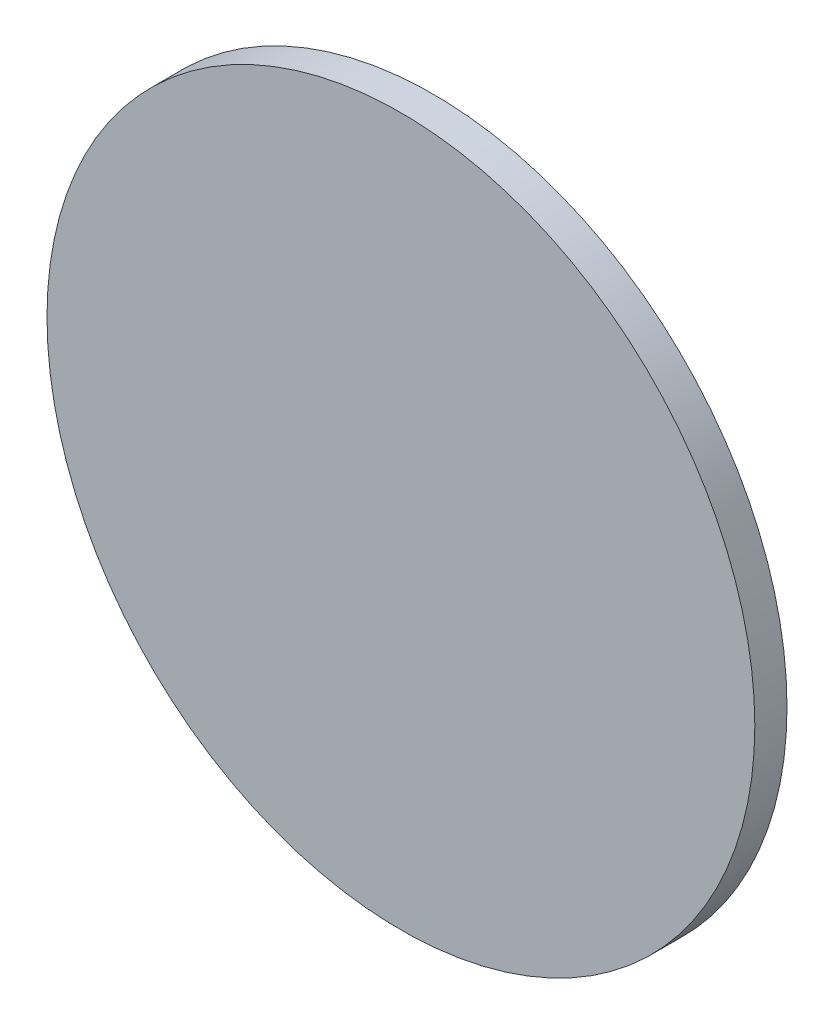
ISO-10303-21;
HEADER;
FILE_DESCRIPTION(('STEP AP214'),'2;1');
FILE_NAME('part.step','',(''),(''),'','','');
FILE_SCHEMA(('AUTOMOTIVE_DESIGN { 1 0 10303 214 1 1 1 1 }'));
ENDSEC;
DATA;
#1=APPLICATION_CONTEXT('core data for automotive mechanical design processes');
#2=APPLICATION_PROTOCOL_DEFINITION('international standard','automotive_design',2000,#1);
#3=PRODUCT_CONTEXT('',#1,'mechanical');
#4=PRODUCT('Part','Part','',(#3));
#5=PRODUCT_RELATED_PRODUCT_CATEGORY('part','',(#4));
#6=PRODUCT_DEFINITION_FORMATION('','',#4);
#7=PRODUCT_DEFINITION_CONTEXT('part definition',#1,'design');
#8=PRODUCT_DEFINITION('design','',#6,#7);
#9=PRODUCT_DEFINITION_SHAPE('','',#8);
#10=(LENGTH_UNIT() NAMED_UNIT(*) SI_UNIT(.MILLI.,.METRE.));
#11=(NAMED_UNIT(*) PLANE_ANGLE_UNIT() SI_UNIT($,.RADIAN.));
#12=(NAMED_UNIT(*) SI_UNIT($,.STERADIAN.) SOLID_ANGLE_UNIT());
#13=UNCERTAINTY_MEASURE_WITH_UNIT(LENGTH_MEASURE(1.E-05),#10,'distance_accuracy_value','');
#14=(GEOMETRIC_REPRESENTATION_CONTEXT(3) GLOBAL_UNCERTAINTY_ASSIGNED_CONTEXT((#13)) GLOBAL_UNIT_ASSIGNED_CONTEXT((#10,
#11,#12)) REPRESENTATION_CONTEXT('',''));
#15=CARTESIAN_POINT('',(0.,0.,0.));
#16=DIRECTION('',(0.,0.,1.));
#17=DIRECTION('',(1.,0.,0.));
#18=AXIS2_PLACEMENT_3D('',#15,#16,#17);
#19=CARTESIAN_POINT('',(0.,0.,3.));
#20=DIRECTION('',(0.,0.,-1.));
#21=DIRECTION('',(-1.,0.,0.));
#22=AXIS2_PLACEMENT_3D('',#19,#20,#21);
#23=CYLINDRICAL_SURFACE('',#22,33.);
#24=CARTESIAN_POINT('',(0.,0.,3.));
#25=DIRECTION('',(0.,0.,1.));
#26=DIRECTION('',(1.,0.,0.));
#27=AXIS2_PLACEMENT_3D('',#24,#25,#26);
#28=CIRCLE('',#27,33.);
#29=CARTESIAN_POINT('',(33.,0.,3.));
#30=VERTEX_POINT('',#29);
#31=EDGE_CURVE('E10',#30,#30,#28,.T.);
#32=ORIENTED_EDGE('',*,*,#31,.F.);
#33=EDGE_LOOP('',(#32));
#34=FACE_BOUND('',#33,.T.);
#35=CARTESIAN_POINT('',(0.,0.,0.));
#36=DIRECTION('',(0.,0.,1.));
#37=DIRECTION('',(1.,0.,0.));
#38=AXIS2_PLACEMENT_3D('',#35,#36,#37);
#39=CIRCLE('',#38,33.);
#40=CARTESIAN_POINT('',(33.,0.,0.));
#41=VERTEX_POINT('',#40);
#42=EDGE_CURVE('E34',#41,#41,#39,.T.);
#43=ORIENTED_EDGE('',*,*,#42,.T.);
#44=EDGE_LOOP('',(#43));
#45=FACE_BOUND('',#44,.T.);
#46=ADVANCED_FACE('F31',(#34,#45),#23,.T.);
#47=CARTESIAN_POINT('',(0.,0.,3.));
#48=DIRECTION('',(0.,0.,1.));
#49=DIRECTION('',(1.,0.,0.));
#50=AXIS2_PLACEMENT_3D('',#47,#48,#49);
#51=PLANE('',#50);
#52=ORIENTED_EDGE('',*,*,#31,.T.);
#53=EDGE_LOOP('',(#52));
#54=FACE_BOUND('',#53,.T.);
#55=ADVANCED_FACE('F46',(#54),#51,.T.);
#56=CARTESIAN_POINT('',(0.,0.,0.));
#57=DIRECTION('',(0.,0.,1.));
#58=DIRECTION('',(1.,0.,0.));
#59=AXIS2_PLACEMENT_3D('',#56,#57,#58);
#60=PLANE('',#59);
#61=ORIENTED_EDGE('',*,*,#42,.F.);
#62=EDGE_LOOP('',(#61));
#63=FACE_BOUND('',#62,.T.);
#64=ADVANCED_FACE('F44',(#63),#60,.F.);
#65=CLOSED_SHELL('',(#46,#55,#64));
#66=MANIFOLD_SOLID_BREP('B2',#65);
#67=ADVANCED_BREP_SHAPE_REPRESENTATION('',(#18,#66),#14);
#68=SHAPE_DEFINITION_REPRESENTATION(#9,#67);
ENDSEC;
END-ISO-10303-21;
